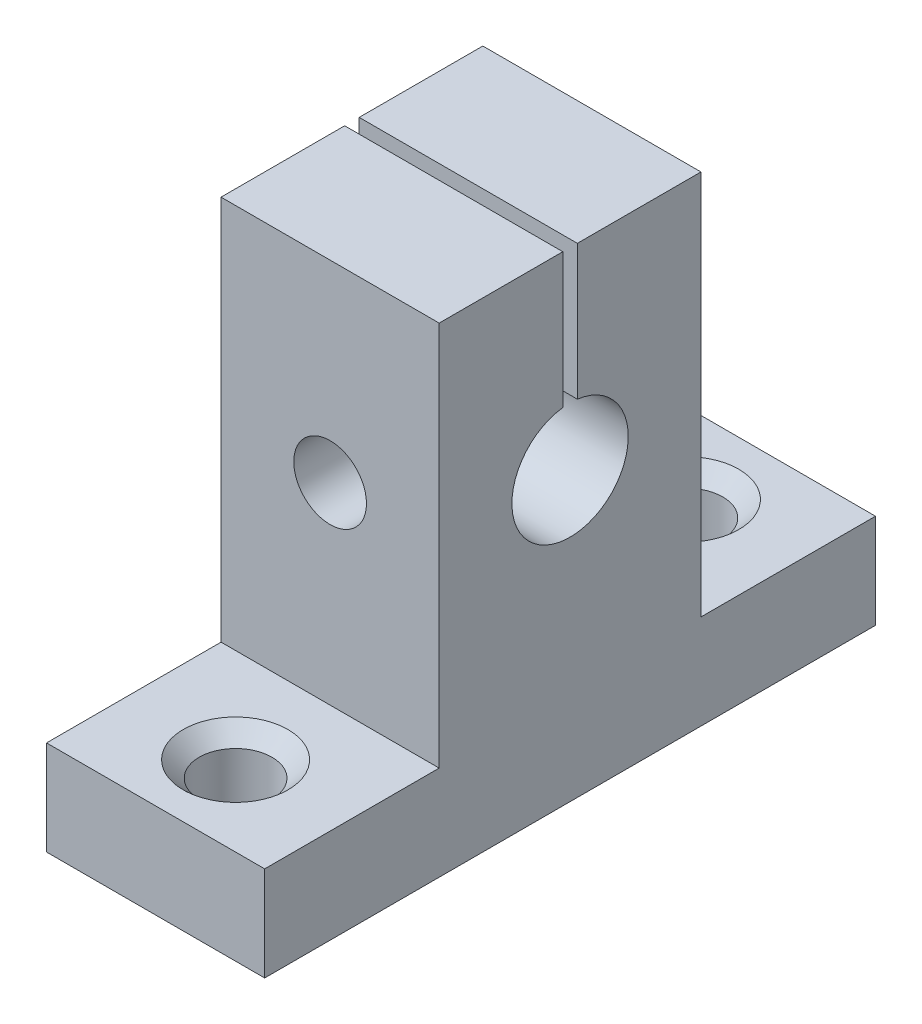
ISO-10303-21;
HEADER;
FILE_DESCRIPTION(('STEP AP214'),'2;1');
FILE_NAME('part.step','',(''),(''),'','','');
FILE_SCHEMA(('AUTOMOTIVE_DESIGN { 1 0 10303 214 1 1 1 1 }'));
ENDSEC;
DATA;
#1=APPLICATION_CONTEXT('core data for automotive mechanical design processes');
#2=APPLICATION_PROTOCOL_DEFINITION('international standard','automotive_design',2000,#1);
#3=PRODUCT_CONTEXT('',#1,'mechanical');
#4=PRODUCT('Part','Part','',(#3));
#5=PRODUCT_RELATED_PRODUCT_CATEGORY('part','',(#4));
#6=PRODUCT_DEFINITION_FORMATION('','',#4);
#7=PRODUCT_DEFINITION_CONTEXT('part definition',#1,'design');
#8=PRODUCT_DEFINITION('design','',#6,#7);
#9=PRODUCT_DEFINITION_SHAPE('','',#8);
#10=(LENGTH_UNIT() NAMED_UNIT(*) SI_UNIT(.MILLI.,.METRE.));
#11=(NAMED_UNIT(*) PLANE_ANGLE_UNIT() SI_UNIT($,.RADIAN.));
#12=(NAMED_UNIT(*) SI_UNIT($,.STERADIAN.) SOLID_ANGLE_UNIT());
#13=UNCERTAINTY_MEASURE_WITH_UNIT(LENGTH_MEASURE(1.E-05),#10,'distance_accuracy_value','');
#14=(GEOMETRIC_REPRESENTATION_CONTEXT(3) GLOBAL_UNCERTAINTY_ASSIGNED_CONTEXT((#13)) GLOBAL_UNIT_ASSIGNED_CONTEXT((#10,
#11,#12)) REPRESENTATION_CONTEXT('',''));
#15=CARTESIAN_POINT('',(0.,0.,0.));
#16=DIRECTION('',(0.,0.,1.));
#17=DIRECTION('',(1.,0.,0.));
#18=AXIS2_PLACEMENT_3D('',#15,#16,#17);
#19=CARTESIAN_POINT('',(15.,6.5,0.));
#20=DIRECTION('',(0.,0.,-1.));
#21=DIRECTION('',(0.,1.,0.));
#22=AXIS2_PLACEMENT_3D('',#19,#20,#21);
#23=PLANE('',#22);
#24=DIRECTION('',(0.,-1.,0.));
#25=VECTOR('',#24,1.);
#26=CARTESIAN_POINT('',(0.,6.5,0.));
#27=LINE('',#26,#25);
#28=CARTESIAN_POINT('',(0.,6.5,0.));
#29=VERTEX_POINT('',#28);
#30=CARTESIAN_POINT('',(0.,0.,0.));
#31=VERTEX_POINT('',#30);
#32=EDGE_CURVE('E163',#29,#31,#27,.T.);
#33=ORIENTED_EDGE('',*,*,#32,.T.);
#34=DIRECTION('',(-1.,0.,0.));
#35=VECTOR('',#34,1.);
#36=CARTESIAN_POINT('',(15.,0.,0.));
#37=LINE('',#36,#35);
#38=CARTESIAN_POINT('',(15.,0.,0.));
#39=VERTEX_POINT('',#38);
#40=EDGE_CURVE('E211',#39,#31,#37,.T.);
#41=ORIENTED_EDGE('',*,*,#40,.F.);
#42=DIRECTION('',(0.,-1.,0.));
#43=VECTOR('',#42,1.);
#44=CARTESIAN_POINT('',(15.,6.5,0.));
#45=LINE('',#44,#43);
#46=CARTESIAN_POINT('',(15.,6.5,0.));
#47=VERTEX_POINT('',#46);
#48=EDGE_CURVE('E186',#47,#39,#45,.T.);
#49=ORIENTED_EDGE('',*,*,#48,.F.);
#50=DIRECTION('',(-1.,0.,0.));
#51=VECTOR('',#50,1.);
#52=CARTESIAN_POINT('',(15.,6.5,0.));
#53=LINE('',#52,#51);
#54=EDGE_CURVE('E159',#47,#29,#53,.T.);
#55=ORIENTED_EDGE('',*,*,#54,.T.);
#56=EDGE_LOOP('',(#33,#41,#49,#55));
#57=FACE_BOUND('',#56,.T.);
#58=ADVANCED_FACE('F40',(#57),#23,.F.);
#59=CARTESIAN_POINT('',(15.,0.,0.));
#60=DIRECTION('',(0.,1.,0.));
#61=DIRECTION('',(0.,0.,1.));
#62=AXIS2_PLACEMENT_3D('',#59,#60,#61);
#63=PLANE('',#62);
#64=CARTESIAN_POINT('',(7.5,0.,-5.5));
#65=DIRECTION('',(0.,1.,0.));
#66=DIRECTION('',(0.,0.,1.));
#67=AXIS2_PLACEMENT_3D('',#64,#65,#66);
#68=CIRCLE('',#67,2.5);
#69=CARTESIAN_POINT('',(7.5,0.,-3.));
#70=VERTEX_POINT('',#69);
#71=EDGE_CURVE('E167',#70,#70,#68,.T.);
#72=ORIENTED_EDGE('',*,*,#71,.T.);
#73=EDGE_LOOP('',(#72));
#74=FACE_BOUND('',#73,.T.);
#75=CARTESIAN_POINT('',(7.5,0.,-36.5));
#76=DIRECTION('',(0.,1.,0.));
#77=DIRECTION('',(0.,0.,1.));
#78=AXIS2_PLACEMENT_3D('',#75,#76,#77);
#79=CIRCLE('',#78,2.5);
#80=CARTESIAN_POINT('',(7.5,0.,-34.));
#81=VERTEX_POINT('',#80);
#82=EDGE_CURVE('E312',#81,#81,#79,.T.);
#83=ORIENTED_EDGE('',*,*,#82,.T.);
#84=EDGE_LOOP('',(#83));
#85=FACE_BOUND('',#84,.T.);
#86=DIRECTION('',(0.,0.,-1.));
#87=VECTOR('',#86,1.);
#88=CARTESIAN_POINT('',(0.,0.,0.));
#89=LINE('',#88,#87);
#90=CARTESIAN_POINT('',(0.,0.,-42.));
#91=VERTEX_POINT('',#90);
#92=EDGE_CURVE('E166',#31,#91,#89,.T.);
#93=ORIENTED_EDGE('',*,*,#92,.T.);
#94=DIRECTION('',(-1.,0.,0.));
#95=VECTOR('',#94,1.);
#96=CARTESIAN_POINT('',(15.,0.,-42.));
#97=LINE('',#96,#95);
#98=CARTESIAN_POINT('',(15.,0.,-42.));
#99=VERTEX_POINT('',#98);
#100=EDGE_CURVE('E208',#99,#91,#97,.T.);
#101=ORIENTED_EDGE('',*,*,#100,.F.);
#102=DIRECTION('',(0.,0.,-1.));
#103=VECTOR('',#102,1.);
#104=CARTESIAN_POINT('',(15.,0.,0.));
#105=LINE('',#104,#103);
#106=EDGE_CURVE('E114',#39,#99,#105,.T.);
#107=ORIENTED_EDGE('',*,*,#106,.F.);
#108=ORIENTED_EDGE('',*,*,#40,.T.);
#109=EDGE_LOOP('',(#93,#101,#107,#108));
#110=FACE_BOUND('',#109,.T.);
#111=ADVANCED_FACE('F238',(#74,#85,#110),#63,.F.);
#112=CARTESIAN_POINT('',(15.,0.,-42.));
#113=DIRECTION('',(0.,0.,1.));
#114=DIRECTION('',(1.,0.,0.));
#115=AXIS2_PLACEMENT_3D('',#112,#113,#114);
#116=PLANE('',#115);
#117=DIRECTION('',(0.,1.,0.));
#118=VECTOR('',#117,1.);
#119=CARTESIAN_POINT('',(0.,0.,-42.));
#120=LINE('',#119,#118);
#121=CARTESIAN_POINT('',(0.,6.50000000000001,-42.));
#122=VERTEX_POINT('',#121);
#123=EDGE_CURVE('E169',#91,#122,#120,.T.);
#124=ORIENTED_EDGE('',*,*,#123,.T.);
#125=DIRECTION('',(-1.,0.,0.));
#126=VECTOR('',#125,1.);
#127=CARTESIAN_POINT('',(15.,6.50000000000001,-42.));
#128=LINE('',#127,#126);
#129=CARTESIAN_POINT('',(15.,6.50000000000001,-42.));
#130=VERTEX_POINT('',#129);
#131=EDGE_CURVE('E205',#130,#122,#128,.T.);
#132=ORIENTED_EDGE('',*,*,#131,.F.);
#133=DIRECTION('',(0.,1.,0.));
#134=VECTOR('',#133,1.);
#135=CARTESIAN_POINT('',(15.,0.,-42.));
#136=LINE('',#135,#134);
#137=EDGE_CURVE('E319',#99,#130,#136,.T.);
#138=ORIENTED_EDGE('',*,*,#137,.F.);
#139=ORIENTED_EDGE('',*,*,#100,.T.);
#140=EDGE_LOOP('',(#124,#132,#138,#139));
#141=FACE_BOUND('',#140,.T.);
#142=ADVANCED_FACE('F245',(#141),#116,.F.);
#143=CARTESIAN_POINT('',(15.,6.50000000000001,-42.));
#144=DIRECTION('',(0.,-1.,0.));
#145=DIRECTION('',(0.,0.,-1.));
#146=AXIS2_PLACEMENT_3D('',#143,#144,#145);
#147=PLANE('',#146);
#148=CARTESIAN_POINT('',(7.5,6.50000000000001,-36.5));
#149=DIRECTION('',(0.,-1.,0.));
#150=DIRECTION('',(0.,0.,-1.));
#151=AXIS2_PLACEMENT_3D('',#148,#149,#150);
#152=CIRCLE('',#151,3.6);
#153=CARTESIAN_POINT('',(7.5,6.50000000000001,-40.1));
#154=VERTEX_POINT('',#153);
#155=EDGE_CURVE('E11',#154,#154,#152,.T.);
#156=ORIENTED_EDGE('',*,*,#155,.T.);
#157=EDGE_LOOP('',(#156));
#158=FACE_BOUND('',#157,.T.);
#159=DIRECTION('',(0.,0.,1.));
#160=VECTOR('',#159,1.);
#161=CARTESIAN_POINT('',(0.,6.50000000000001,-42.));
#162=LINE('',#161,#160);
#163=CARTESIAN_POINT('',(0.,6.50000000000001,-30.));
#164=VERTEX_POINT('',#163);
#165=EDGE_CURVE('E171',#122,#164,#162,.T.);
#166=ORIENTED_EDGE('',*,*,#165,.T.);
#167=DIRECTION('',(-1.,0.,0.));
#168=VECTOR('',#167,1.);
#169=CARTESIAN_POINT('',(15.,6.50000000000001,-30.));
#170=LINE('',#169,#168);
#171=CARTESIAN_POINT('',(15.,6.50000000000001,-30.));
#172=VERTEX_POINT('',#171);
#173=EDGE_CURVE('E202',#172,#164,#170,.T.);
#174=ORIENTED_EDGE('',*,*,#173,.F.);
#175=DIRECTION('',(0.,0.,1.));
#176=VECTOR('',#175,1.);
#177=CARTESIAN_POINT('',(15.,6.50000000000001,-42.));
#178=LINE('',#177,#176);
#179=EDGE_CURVE('E321',#130,#172,#178,.T.);
#180=ORIENTED_EDGE('',*,*,#179,.F.);
#181=ORIENTED_EDGE('',*,*,#131,.T.);
#182=EDGE_LOOP('',(#166,#174,#180,#181));
#183=FACE_BOUND('',#182,.T.);
#184=ADVANCED_FACE('F255',(#158,#183),#147,.F.);
#185=CARTESIAN_POINT('',(15.,6.50000000000001,-30.));
#186=DIRECTION('',(0.,0.,1.));
#187=DIRECTION('',(1.,0.,0.));
#188=AXIS2_PLACEMENT_3D('',#185,#186,#187);
#189=PLANE('',#188);
#190=DIRECTION('',(0.,1.,0.));
#191=VECTOR('',#190,1.);
#192=CARTESIAN_POINT('',(0.,6.50000000000001,-30.));
#193=LINE('',#192,#191);
#194=CARTESIAN_POINT('',(0.,33.,-30.));
#195=VERTEX_POINT('',#194);
#196=EDGE_CURVE('E173',#164,#195,#193,.T.);
#197=ORIENTED_EDGE('',*,*,#196,.T.);
#198=DIRECTION('',(-1.,0.,0.));
#199=VECTOR('',#198,1.);
#200=CARTESIAN_POINT('',(15.,33.,-30.));
#201=LINE('',#200,#199);
#202=CARTESIAN_POINT('',(15.,33.,-30.));
#203=VERTEX_POINT('',#202);
#204=EDGE_CURVE('E199',#203,#195,#201,.T.);
#205=ORIENTED_EDGE('',*,*,#204,.F.);
#206=DIRECTION('',(0.,1.,0.));
#207=VECTOR('',#206,1.);
#208=CARTESIAN_POINT('',(15.,6.50000000000001,-30.));
#209=LINE('',#208,#207);
#210=EDGE_CURVE('E323',#172,#203,#209,.T.);
#211=ORIENTED_EDGE('',*,*,#210,.F.);
#212=ORIENTED_EDGE('',*,*,#173,.T.);
#213=EDGE_LOOP('',(#197,#205,#211,#212));
#214=FACE_BOUND('',#213,.T.);
#215=ADVANCED_FACE('F259',(#214),#189,.F.);
#216=CARTESIAN_POINT('',(15.,33.,-30.));
#217=DIRECTION('',(0.,-1.,0.));
#218=DIRECTION('',(0.,0.,-1.));
#219=AXIS2_PLACEMENT_3D('',#216,#217,#218);
#220=PLANE('',#219);
#221=DIRECTION('',(0.,0.,1.));
#222=VECTOR('',#221,1.);
#223=CARTESIAN_POINT('',(0.,33.,-30.));
#224=LINE('',#223,#222);
#225=CARTESIAN_POINT('',(0.,33.,-21.5));
#226=VERTEX_POINT('',#225);
#227=EDGE_CURVE('E175',#195,#226,#224,.T.);
#228=ORIENTED_EDGE('',*,*,#227,.T.);
#229=DIRECTION('',(-1.,0.,0.));
#230=VECTOR('',#229,1.);
#231=CARTESIAN_POINT('',(15.,33.,-21.5));
#232=LINE('',#231,#230);
#233=CARTESIAN_POINT('',(15.,33.,-21.5));
#234=VERTEX_POINT('',#233);
#235=EDGE_CURVE('E196',#234,#226,#232,.T.);
#236=ORIENTED_EDGE('',*,*,#235,.F.);
#237=DIRECTION('',(0.,0.,1.));
#238=VECTOR('',#237,1.);
#239=CARTESIAN_POINT('',(15.,33.,-30.));
#240=LINE('',#239,#238);
#241=EDGE_CURVE('E325',#203,#234,#240,.T.);
#242=ORIENTED_EDGE('',*,*,#241,.F.);
#243=ORIENTED_EDGE('',*,*,#204,.T.);
#244=EDGE_LOOP('',(#228,#236,#242,#243));
#245=FACE_BOUND('',#244,.T.);
#246=ADVANCED_FACE('F263',(#245),#220,.F.);
#247=CARTESIAN_POINT('',(15.,33.,-21.5));
#248=DIRECTION('',(0.,0.,-1.));
#249=DIRECTION('',(0.,1.,0.));
#250=AXIS2_PLACEMENT_3D('',#247,#248,#249);
#251=PLANE('',#250);
#252=DIRECTION('',(0.,-1.,0.));
#253=VECTOR('',#252,1.);
#254=CARTESIAN_POINT('',(0.,33.,-21.5));
#255=LINE('',#254,#253);
#256=CARTESIAN_POINT('',(0.,23.7186269665969,-21.5));
#257=VERTEX_POINT('',#256);
#258=EDGE_CURVE('E177',#226,#257,#255,.T.);
#259=ORIENTED_EDGE('',*,*,#258,.T.);
#260=DIRECTION('',(-1.,0.,0.));
#261=VECTOR('',#260,1.);
#262=CARTESIAN_POINT('',(15.,23.7186269665969,-21.5));
#263=LINE('',#262,#261);
#264=CARTESIAN_POINT('',(15.,23.7186269665969,-21.5));
#265=VERTEX_POINT('',#264);
#266=EDGE_CURVE('E193',#265,#257,#263,.T.);
#267=ORIENTED_EDGE('',*,*,#266,.F.);
#268=DIRECTION('',(0.,-1.,0.));
#269=VECTOR('',#268,1.);
#270=CARTESIAN_POINT('',(15.,33.,-21.5));
#271=LINE('',#270,#269);
#272=EDGE_CURVE('E327',#234,#265,#271,.T.);
#273=ORIENTED_EDGE('',*,*,#272,.F.);
#274=ORIENTED_EDGE('',*,*,#235,.T.);
#275=EDGE_LOOP('',(#259,#267,#273,#274));
#276=FACE_BOUND('',#275,.T.);
#277=ADVANCED_FACE('F267',(#276),#251,.F.);
#278=CARTESIAN_POINT('',(15.,19.75,-21.));
#279=DIRECTION('',(-1.,0.,0.));
#280=DIRECTION('',(0.,0.,1.));
#281=AXIS2_PLACEMENT_3D('',#278,#279,#280);
#282=CYLINDRICAL_SURFACE('',#281,3.99999999999999);
#283=CARTESIAN_POINT('',(10.,19.75,-17.));
#284=CARTESIAN_POINT('',(9.99998952385639,19.6229825234401,-17.0000095866643));
#285=CARTESIAN_POINT('',(9.99025350009832,19.4958080482083,-17.0061139340601));
#286=CARTESIAN_POINT('',(9.95182887031573,19.2453625433787,-17.0299562444741));
#287=CARTESIAN_POINT('',(9.92310413973879,19.122099424174,-17.0477163812686));
#288=CARTESIAN_POINT('',(9.84837714671246,18.8835891317308,-17.0930830470644));
#289=CARTESIAN_POINT('',(9.80246039021243,18.7683055792906,-17.1206408130912));
#290=CARTESIAN_POINT('',(9.69522833250852,18.5474791956501,-17.1833080016172));
#291=CARTESIAN_POINT('',(9.63391473744687,18.441935286959,-17.2184165873391));
#292=CARTESIAN_POINT('',(9.4922268434089,18.2340516356292,-17.2965969505453));
#293=CARTESIAN_POINT('',(9.41072139729824,18.1326408838321,-17.3400807578211));
#294=CARTESIAN_POINT('',(9.23356165374148,17.9440272443272,-17.4293729994108));
#295=CARTESIAN_POINT('',(9.13788834426107,17.856843784056,-17.4751845021704));
#296=CARTESIAN_POINT('',(8.91993221070879,17.6871425369748,-17.5713916276437));
#297=CARTESIAN_POINT('',(8.79580042656905,17.6068558798168,-17.6215677803385));
#298=CARTESIAN_POINT('',(8.53287036932165,17.4685206792,-17.713396037219));
#299=CARTESIAN_POINT('',(8.39409737483202,17.4104345821256,-17.7550624799954));
#300=CARTESIAN_POINT('',(8.14237895245428,17.3313319881942,-17.8138084875119));
#301=CARTESIAN_POINT('',(8.03206636308168,17.3046089520532,-17.8344618802911));
#302=CARTESIAN_POINT('',(7.80738814861931,17.2663631288086,-17.8643728533914));
#303=CARTESIAN_POINT('',(7.69302848282679,17.2548188751436,-17.8736465262154));
#304=CARTESIAN_POINT('',(7.46317396712363,17.247621633095,-17.879402284655));
#305=CARTESIAN_POINT('',(7.34767692942204,17.2520103179912,-17.8758508257204));
#306=CARTESIAN_POINT('',(7.11937979127336,17.2764736665217,-17.8564519511659));
#307=CARTESIAN_POINT('',(7.00658192715007,17.2965609025485,-17.8405946803451));
#308=CARTESIAN_POINT('',(6.78912310325641,17.3506379053574,-17.7993485417785));
#309=CARTESIAN_POINT('',(6.68433512028263,17.384299564774,-17.7741857134643));
#310=CARTESIAN_POINT('',(6.48167760352679,17.4641963041049,-17.7170886555658));
#311=CARTESIAN_POINT('',(6.38381053215654,17.5104358310596,-17.6851520319148));
#312=CARTESIAN_POINT('',(6.17833359248984,17.6241016959274,-17.6109037490434));
#313=CARTESIAN_POINT('',(6.07231894814762,17.6938722634225,-17.5677684479145));
#314=CARTESIAN_POINT('',(5.8723388730236,17.8482388804136,-17.4798854844529));
#315=CARTESIAN_POINT('',(5.77838599995486,17.9328501674866,-17.4351362028598));
#316=CARTESIAN_POINT('',(5.58939899041739,18.1309526712227,-17.340403325394));
#317=CARTESIAN_POINT('',(5.4967440572784,18.2469055257998,-17.2907742855627));
#318=CARTESIAN_POINT('',(5.33228820636899,18.4957355553149,-17.1994339815933));
#319=CARTESIAN_POINT('',(5.26047909219051,18.6286060487299,-17.1577196077133));
#320=CARTESIAN_POINT('',(5.17265404336502,18.8342242484326,-17.105640241301));
#321=CARTESIAN_POINT('',(5.1471657135696,18.9018064168126,-17.0903312561473));
#322=CARTESIAN_POINT('',(5.10199234952136,19.0395079505216,-17.0629816012456));
#323=CARTESIAN_POINT('',(5.08230396342918,19.1096258240321,-17.0509390441197));
#324=CARTESIAN_POINT('',(5.04906583835761,19.2517609804615,-17.0305030047215));
#325=CARTESIAN_POINT('',(5.035510596474,19.3237764990847,-17.0221062515612));
#326=CARTESIAN_POINT('',(5.01475370668643,19.4690343264393,-17.0092123350867));
#327=CARTESIAN_POINT('',(5.00755097345269,19.5422764234293,-17.0047145056415));
#328=CARTESIAN_POINT('',(4.99689069535646,19.7408808231032,-16.9980622652583));
#329=CARTESIAN_POINT('',(4.99959963687648,19.8667820167057,-16.999761877634));
#330=CARTESIAN_POINT('',(5.02375966446545,20.1159677660117,-17.0148168659169));
#331=CARTESIAN_POINT('',(5.04520947392473,20.23925249936,-17.028171447899));
#332=CARTESIAN_POINT('',(5.10447858798278,20.4750361940026,-17.0645202444463));
#333=CARTESIAN_POINT('',(5.14162472076979,20.5877684210629,-17.0871169362887));
#334=CARTESIAN_POINT('',(5.23059237131243,20.8052781612533,-17.1400859710213));
#335=CARTESIAN_POINT('',(5.28241634650143,20.910054338616,-17.1704596158836));
#336=CARTESIAN_POINT('',(5.40503053750783,21.1201676196919,-17.2401998597934));
#337=CARTESIAN_POINT('',(5.47720717227503,21.2244938029691,-17.2801647324463));
#338=CARTESIAN_POINT('',(5.63558769646929,21.4202854133007,-17.3638605711427));
#339=CARTESIAN_POINT('',(5.72180716888569,21.5117363403803,-17.4075956952687));
#340=CARTESIAN_POINT('',(5.92027008984566,21.6929483527625,-17.5018826151327));
#341=CARTESIAN_POINT('',(6.03447441549753,21.7805370273364,-17.5525023342081));
#342=CARTESIAN_POINT('',(6.27775156698258,21.9356070491644,-17.6486647425311));
#343=CARTESIAN_POINT('',(6.40681401289132,22.0031023169377,-17.6942109329163));
#344=CARTESIAN_POINT('',(6.64938429659957,22.1036954382102,-17.7653293942116));
#345=CARTESIAN_POINT('',(6.76048150138871,22.1410379172069,-17.793087276362));
#346=CARTESIAN_POINT('',(6.98878629161345,22.2000021642075,-17.8378993864875));
#347=CARTESIAN_POINT('',(7.10598401968943,22.2216484980525,-17.8549703347018));
#348=CARTESIAN_POINT('',(7.3441805529704,22.2480276746923,-17.875873500674));
#349=CARTESIAN_POINT('',(7.46519716787993,22.2526637458647,-17.8796299680684));
#350=CARTESIAN_POINT('',(7.70626192382951,22.2443955677353,-17.8730187362428));
#351=CARTESIAN_POINT('',(7.82630972961935,22.2314854882146,-17.8626463422952));
#352=CARTESIAN_POINT('',(8.0520595794361,22.190765470861,-17.8308922299001));
#353=CARTESIAN_POINT('',(8.15813856450237,22.1642384719172,-17.8104638581093));
#354=CARTESIAN_POINT('',(8.36427015751825,22.0983523874343,-17.7616493721478));
#355=CARTESIAN_POINT('',(8.46432023181727,22.0589879509078,-17.7332599402869));
#356=CARTESIAN_POINT('',(8.67119332433813,21.9620541580396,-17.6667220238215));
#357=CARTESIAN_POINT('',(8.77689994626374,21.9026742798167,-17.6277557147592));
#358=CARTESIAN_POINT('',(8.97787738570925,21.7699989488921,-17.5466455467601));
#359=CARTESIAN_POINT('',(9.07313966737408,21.6966922459469,-17.50449913561));
#360=CARTESIAN_POINT('',(9.27002558379842,21.5213466968594,-17.4119632457315));
#361=CARTESIAN_POINT('',(9.36916976153928,21.4164928448989,-17.3615951173972));
#362=CARTESIAN_POINT('',(9.54900159612505,21.1896193799085,-17.2660194616177));
#363=CARTESIAN_POINT('',(9.62967782367751,21.0675892119665,-17.2208151385274));
#364=CARTESIAN_POINT('',(9.73456343855875,20.8734635794255,-17.1604078527159));
#365=CARTESIAN_POINT('',(9.76687480004698,20.806796011581,-17.1414816584294));
#366=CARTESIAN_POINT('',(9.82567225182379,20.6701995843741,-17.1066483460212));
#367=CARTESIAN_POINT('',(9.85216170113509,20.600272633932,-17.0907394877408));
#368=CARTESIAN_POINT('',(9.89885714446216,20.4578736884378,-17.0624662582448));
#369=CARTESIAN_POINT('',(9.91908005724566,20.3854091445723,-17.0500923503482));
#370=CARTESIAN_POINT('',(9.95297545558237,20.2384569895571,-17.0292432254194));
#371=CARTESIAN_POINT('',(9.96665277243948,20.1639709135455,-17.0207651330708));
#372=CARTESIAN_POINT('',(9.98459041022673,20.0328526050941,-17.0096172870823));
#373=CARTESIAN_POINT('',(9.99036153025218,19.9765015159149,-17.0060184048241));
#374=CARTESIAN_POINT('',(9.99806878362715,19.8634440745191,-17.0012075462707));
#375=CARTESIAN_POINT('',(10.0000046796104,19.8067377005313,-16.999995717713));
#376=CARTESIAN_POINT('',(10.,19.75,-17.));
#377=B_SPLINE_CURVE_WITH_KNOTS('',3,(#283,#284,#285,#286,#287,#288,#289,#290,#291,#292,#293,
#294,#295,#296,#297,#298,#299,#300,#301,#302,#303,#304,#305,#306,#307,#308,#309,#310,#311,#312,
#313,#314,#315,#316,#317,#318,#319,#320,#321,#322,#323,#324,#325,#326,#327,#328,#329,#330,#331,
#332,#333,#334,#335,#336,#337,#338,#339,#340,#341,#342,#343,#344,#345,#346,#347,#348,#349,#350,
#351,#352,#353,#354,#355,#356,#357,#358,#359,#360,#361,#362,#363,#364,#365,#366,#367,#368,#369,
#370,#371,#372,#373,#374,#375,#376),.UNSPECIFIED.,.T.,.F.,(4,2,2,2,2,2,2,2,2,2,2,2,2,2,2,2,2,2,
2,2,2,2,2,2,2,2,2,2,2,2,2,2,2,2,2,2,2,2,2,2,2,2,2,2,2,2,4),(0.,0.380824602868265,
0.762375788256924,1.14205397519028,1.5216901080776,1.93164374107244,2.34215256651403,
2.80825951705947,3.27357449214021,3.61824017759434,3.96241789414782,4.30749646997556,
4.65285169010166,4.99031678920873,5.32790135816066,5.72854900708719,6.12961045150363,
6.59684361399044,7.06389281455722,7.28510978359955,7.50619865744382,7.72708876613707,
7.94794112831293,8.32363778110177,8.69930884379593,9.06028425977629,9.42132014771965,
9.81879878896137,10.216721545704,10.6724083464246,11.1277787130885,11.4876929754247,
11.8470427174174,12.2084336629143,12.5699447204276,12.9023575499051,13.2349091154192,
13.6156046298899,13.9966089922257,14.4531049498525,14.9098826607203,15.138984863948,
15.3679545348469,15.5963005225022,15.8244777070605,15.994578512822,16.1646898459841),.UNSPECIFIED.);
#378=CARTESIAN_POINT('',(10.,19.75,-17.));
#379=VERTEX_POINT('',#378);
#380=EDGE_CURVE('E303',#379,#379,#377,.T.);
#381=ORIENTED_EDGE('',*,*,#380,.F.);
#382=EDGE_LOOP('',(#381));
#383=FACE_BOUND('',#382,.T.);
#384=CARTESIAN_POINT('',(0.,19.75,-21.));
#385=DIRECTION('',(-1.,0.,0.));
#386=DIRECTION('',(0.,0.,-1.));
#387=AXIS2_PLACEMENT_3D('',#384,#385,#386);
#388=CIRCLE('',#387,3.99999999999999);
#389=CARTESIAN_POINT('',(0.,23.7186269665969,-20.5));
#390=VERTEX_POINT('',#389);
#391=EDGE_CURVE('E179',#257,#390,#388,.T.);
#392=ORIENTED_EDGE('',*,*,#391,.T.);
#393=DIRECTION('',(-1.,0.,0.));
#394=VECTOR('',#393,1.);
#395=CARTESIAN_POINT('',(15.,23.7186269665969,-20.5));
#396=LINE('',#395,#394);
#397=CARTESIAN_POINT('',(15.,23.7186269665969,-20.5));
#398=VERTEX_POINT('',#397);
#399=EDGE_CURVE('E190',#398,#390,#396,.T.);
#400=ORIENTED_EDGE('',*,*,#399,.F.);
#401=CARTESIAN_POINT('',(15.,19.75,-21.));
#402=DIRECTION('',(-1.,0.,0.));
#403=DIRECTION('',(0.,0.,-1.));
#404=AXIS2_PLACEMENT_3D('',#401,#402,#403);
#405=CIRCLE('',#404,3.99999999999999);
#406=EDGE_CURVE('E329',#265,#398,#405,.T.);
#407=ORIENTED_EDGE('',*,*,#406,.F.);
#408=ORIENTED_EDGE('',*,*,#266,.T.);
#409=EDGE_LOOP('',(#392,#400,#407,#408));
#410=FACE_BOUND('',#409,.T.);
#411=ADVANCED_FACE('F271',(#383,#410),#282,.F.);
#412=CARTESIAN_POINT('',(15.,33.,-20.5));
#413=DIRECTION('',(0.,0.,1.));
#414=DIRECTION('',(0.,-1.,0.));
#415=AXIS2_PLACEMENT_3D('',#412,#413,#414);
#416=PLANE('',#415);
#417=DIRECTION('',(0.,1.,0.));
#418=VECTOR('',#417,1.);
#419=CARTESIAN_POINT('',(0.,33.,-20.5));
#420=LINE('',#419,#418);
#421=CARTESIAN_POINT('',(0.,33.,-20.5));
#422=VERTEX_POINT('',#421);
#423=EDGE_CURVE('E181',#390,#422,#420,.T.);
#424=ORIENTED_EDGE('',*,*,#423,.T.);
#425=DIRECTION('',(-1.,0.,0.));
#426=VECTOR('',#425,1.);
#427=CARTESIAN_POINT('',(15.,33.,-20.5));
#428=LINE('',#427,#426);
#429=CARTESIAN_POINT('',(15.,33.,-20.5));
#430=VERTEX_POINT('',#429);
#431=EDGE_CURVE('E154',#430,#422,#428,.T.);
#432=ORIENTED_EDGE('',*,*,#431,.F.);
#433=DIRECTION('',(0.,1.,0.));
#434=VECTOR('',#433,1.);
#435=CARTESIAN_POINT('',(15.,33.,-20.5));
#436=LINE('',#435,#434);
#437=EDGE_CURVE('E145',#398,#430,#436,.T.);
#438=ORIENTED_EDGE('',*,*,#437,.F.);
#439=ORIENTED_EDGE('',*,*,#399,.T.);
#440=EDGE_LOOP('',(#424,#432,#438,#439));
#441=FACE_BOUND('',#440,.T.);
#442=ADVANCED_FACE('F274',(#441),#416,.F.);
#443=CARTESIAN_POINT('',(15.,33.,-20.5));
#444=DIRECTION('',(0.,-1.,0.));
#445=DIRECTION('',(0.,0.,-1.));
#446=AXIS2_PLACEMENT_3D('',#443,#444,#445);
#447=PLANE('',#446);
#448=DIRECTION('',(0.,0.,1.));
#449=VECTOR('',#448,1.);
#450=CARTESIAN_POINT('',(0.,33.,-20.5));
#451=LINE('',#450,#449);
#452=CARTESIAN_POINT('',(0.,33.,-12.));
#453=VERTEX_POINT('',#452);
#454=EDGE_CURVE('E153',#422,#453,#451,.T.);
#455=ORIENTED_EDGE('',*,*,#454,.T.);
#456=DIRECTION('',(-1.,0.,0.));
#457=VECTOR('',#456,1.);
#458=CARTESIAN_POINT('',(15.,33.,-12.));
#459=LINE('',#458,#457);
#460=CARTESIAN_POINT('',(15.,33.,-12.));
#461=VERTEX_POINT('',#460);
#462=EDGE_CURVE('E150',#461,#453,#459,.T.);
#463=ORIENTED_EDGE('',*,*,#462,.F.);
#464=DIRECTION('',(0.,0.,1.));
#465=VECTOR('',#464,1.);
#466=CARTESIAN_POINT('',(15.,33.,-20.5));
#467=LINE('',#466,#465);
#468=EDGE_CURVE('E139',#430,#461,#467,.T.);
#469=ORIENTED_EDGE('',*,*,#468,.F.);
#470=ORIENTED_EDGE('',*,*,#431,.T.);
#471=EDGE_LOOP('',(#455,#463,#469,#470));
#472=FACE_BOUND('',#471,.T.);
#473=ADVANCED_FACE('F151',(#472),#447,.F.);
#474=CARTESIAN_POINT('',(15.,33.,-12.));
#475=DIRECTION('',(0.,0.,-1.));
#476=DIRECTION('',(0.,1.,0.));
#477=AXIS2_PLACEMENT_3D('',#474,#475,#476);
#478=PLANE('',#477);
#479=CARTESIAN_POINT('',(7.5,19.75,-12.));
#480=DIRECTION('',(0.,0.,1.));
#481=DIRECTION('',(1.,0.,0.));
#482=AXIS2_PLACEMENT_3D('',#479,#480,#481);
#483=CIRCLE('',#482,2.5);
#484=CARTESIAN_POINT('',(10.,19.75,-12.));
#485=VERTEX_POINT('',#484);
#486=EDGE_CURVE('E309',#485,#485,#483,.T.);
#487=ORIENTED_EDGE('',*,*,#486,.F.);
#488=EDGE_LOOP('',(#487));
#489=FACE_BOUND('',#488,.T.);
#490=DIRECTION('',(0.,-1.,0.));
#491=VECTOR('',#490,1.);
#492=CARTESIAN_POINT('',(0.,33.,-12.));
#493=LINE('',#492,#491);
#494=CARTESIAN_POINT('',(0.,6.5,-12.));
#495=VERTEX_POINT('',#494);
#496=EDGE_CURVE('E99',#453,#495,#493,.T.);
#497=ORIENTED_EDGE('',*,*,#496,.T.);
#498=DIRECTION('',(-1.,0.,0.));
#499=VECTOR('',#498,1.);
#500=CARTESIAN_POINT('',(15.,6.5,-12.));
#501=LINE('',#500,#499);
#502=CARTESIAN_POINT('',(15.,6.5,-12.));
#503=VERTEX_POINT('',#502);
#504=EDGE_CURVE('E155',#503,#495,#501,.T.);
#505=ORIENTED_EDGE('',*,*,#504,.F.);
#506=DIRECTION('',(0.,-1.,0.));
#507=VECTOR('',#506,1.);
#508=CARTESIAN_POINT('',(15.,33.,-12.));
#509=LINE('',#508,#507);
#510=EDGE_CURVE('E143',#461,#503,#509,.T.);
#511=ORIENTED_EDGE('',*,*,#510,.F.);
#512=ORIENTED_EDGE('',*,*,#462,.T.);
#513=EDGE_LOOP('',(#497,#505,#511,#512));
#514=FACE_BOUND('',#513,.T.);
#515=ADVANCED_FACE('F157',(#489,#514),#478,.F.);
#516=CARTESIAN_POINT('',(15.,6.5,-12.));
#517=DIRECTION('',(0.,-1.,0.));
#518=DIRECTION('',(0.,0.,-1.));
#519=AXIS2_PLACEMENT_3D('',#516,#517,#518);
#520=PLANE('',#519);
#521=CARTESIAN_POINT('',(7.5,6.5,-5.5));
#522=DIRECTION('',(0.,-1.,0.));
#523=DIRECTION('',(0.,0.,-1.));
#524=AXIS2_PLACEMENT_3D('',#521,#522,#523);
#525=CIRCLE('',#524,3.59999999999998);
#526=CARTESIAN_POINT('',(7.5,6.5,-9.09999999999998));
#527=VERTEX_POINT('',#526);
#528=EDGE_CURVE('E216',#527,#527,#525,.T.);
#529=ORIENTED_EDGE('',*,*,#528,.T.);
#530=EDGE_LOOP('',(#529));
#531=FACE_BOUND('',#530,.T.);
#532=DIRECTION('',(0.,0.,1.));
#533=VECTOR('',#532,1.);
#534=CARTESIAN_POINT('',(0.,6.5,-12.));
#535=LINE('',#534,#533);
#536=EDGE_CURVE('E105',#495,#29,#535,.T.);
#537=ORIENTED_EDGE('',*,*,#536,.T.);
#538=ORIENTED_EDGE('',*,*,#54,.F.);
#539=DIRECTION('',(0.,0.,1.));
#540=VECTOR('',#539,1.);
#541=CARTESIAN_POINT('',(15.,6.5,-12.));
#542=LINE('',#541,#540);
#543=EDGE_CURVE('E58',#503,#47,#542,.T.);
#544=ORIENTED_EDGE('',*,*,#543,.F.);
#545=ORIENTED_EDGE('',*,*,#504,.T.);
#546=EDGE_LOOP('',(#537,#538,#544,#545));
#547=FACE_BOUND('',#546,.T.);
#548=ADVANCED_FACE('F283',(#531,#547),#520,.F.);
#549=CARTESIAN_POINT('',(15.,19.75,-21.));
#550=DIRECTION('',(1.,0.,0.));
#551=DIRECTION('',(0.,0.,-1.));
#552=AXIS2_PLACEMENT_3D('',#549,#550,#551);
#553=PLANE('',#552);
#554=ORIENTED_EDGE('',*,*,#48,.T.);
#555=ORIENTED_EDGE('',*,*,#106,.T.);
#556=ORIENTED_EDGE('',*,*,#137,.T.);
#557=ORIENTED_EDGE('',*,*,#179,.T.);
#558=ORIENTED_EDGE('',*,*,#210,.T.);
#559=ORIENTED_EDGE('',*,*,#241,.T.);
#560=ORIENTED_EDGE('',*,*,#272,.T.);
#561=ORIENTED_EDGE('',*,*,#406,.T.);
#562=ORIENTED_EDGE('',*,*,#437,.T.);
#563=ORIENTED_EDGE('',*,*,#468,.T.);
#564=ORIENTED_EDGE('',*,*,#510,.T.);
#565=ORIENTED_EDGE('',*,*,#543,.T.);
#566=EDGE_LOOP('',(#554,#555,#556,#557,#558,#559,#560,#561,#562,#563,#564,#565));
#567=FACE_BOUND('',#566,.T.);
#568=ADVANCED_FACE('F141',(#567),#553,.T.);
#569=CARTESIAN_POINT('',(0.,19.75,-21.));
#570=DIRECTION('',(1.,0.,0.));
#571=DIRECTION('',(0.,0.,-1.));
#572=AXIS2_PLACEMENT_3D('',#569,#570,#571);
#573=PLANE('',#572);
#574=ORIENTED_EDGE('',*,*,#32,.F.);
#575=ORIENTED_EDGE('',*,*,#536,.F.);
#576=ORIENTED_EDGE('',*,*,#496,.F.);
#577=ORIENTED_EDGE('',*,*,#454,.F.);
#578=ORIENTED_EDGE('',*,*,#423,.F.);
#579=ORIENTED_EDGE('',*,*,#391,.F.);
#580=ORIENTED_EDGE('',*,*,#258,.F.);
#581=ORIENTED_EDGE('',*,*,#227,.F.);
#582=ORIENTED_EDGE('',*,*,#196,.F.);
#583=ORIENTED_EDGE('',*,*,#165,.F.);
#584=ORIENTED_EDGE('',*,*,#123,.F.);
#585=ORIENTED_EDGE('',*,*,#92,.F.);
#586=EDGE_LOOP('',(#574,#575,#576,#577,#578,#579,#580,#581,#582,#583,#584,#585));
#587=FACE_BOUND('',#586,.T.);
#588=ADVANCED_FACE('F288',(#587),#573,.F.);
#589=CARTESIAN_POINT('',(7.5,0.,-5.5));
#590=DIRECTION('',(0.,1.,0.));
#591=DIRECTION('',(0.,0.,1.));
#592=AXIS2_PLACEMENT_3D('',#589,#590,#591);
#593=CYLINDRICAL_SURFACE('',#592,2.5);
#594=CARTESIAN_POINT('',(7.5,5.40000000000003,-5.5));
#595=DIRECTION('',(0.,-1.,0.));
#596=DIRECTION('',(0.,0.,-1.));
#597=AXIS2_PLACEMENT_3D('',#594,#595,#596);
#598=CIRCLE('',#597,2.5);
#599=CARTESIAN_POINT('',(7.5,5.40000000000003,-8.));
#600=VERTEX_POINT('',#599);
#601=EDGE_CURVE('E213',#600,#600,#598,.F.);
#602=ORIENTED_EDGE('',*,*,#601,.T.);
#603=EDGE_LOOP('',(#602));
#604=FACE_BOUND('',#603,.T.);
#605=ORIENTED_EDGE('',*,*,#71,.F.);
#606=EDGE_LOOP('',(#605));
#607=FACE_BOUND('',#606,.T.);
#608=ADVANCED_FACE('F291',(#604,#607),#593,.F.);
#609=CARTESIAN_POINT('',(7.5,0.,-36.5));
#610=DIRECTION('',(0.,1.,0.));
#611=DIRECTION('',(0.,0.,1.));
#612=AXIS2_PLACEMENT_3D('',#609,#610,#611);
#613=CYLINDRICAL_SURFACE('',#612,2.5);
#614=CARTESIAN_POINT('',(7.5,5.40000000000002,-36.5));
#615=DIRECTION('',(0.,-1.,0.));
#616=DIRECTION('',(0.,0.,-1.));
#617=AXIS2_PLACEMENT_3D('',#614,#615,#616);
#618=CIRCLE('',#617,2.5);
#619=CARTESIAN_POINT('',(7.5,5.40000000000002,-39.));
#620=VERTEX_POINT('',#619);
#621=EDGE_CURVE('E50',#620,#620,#618,.F.);
#622=ORIENTED_EDGE('',*,*,#621,.T.);
#623=EDGE_LOOP('',(#622));
#624=FACE_BOUND('',#623,.T.);
#625=ORIENTED_EDGE('',*,*,#82,.F.);
#626=EDGE_LOOP('',(#625));
#627=FACE_BOUND('',#626,.T.);
#628=ADVANCED_FACE('F221',(#624,#627),#613,.F.);
#629=CARTESIAN_POINT('',(7.5,5.40000000000003,-5.5));
#630=DIRECTION('',(0.,1.,0.));
#631=DIRECTION('',(0.,0.,1.));
#632=AXIS2_PLACEMENT_3D('',#629,#630,#631);
#633=CONICAL_SURFACE('',#632,2.5,0.785398163397451);
#634=ORIENTED_EDGE('',*,*,#528,.F.);
#635=EDGE_LOOP('',(#634));
#636=FACE_BOUND('',#635,.T.);
#637=ORIENTED_EDGE('',*,*,#601,.F.);
#638=EDGE_LOOP('',(#637));
#639=FACE_BOUND('',#638,.T.);
#640=ADVANCED_FACE('F226',(#636,#639),#633,.F.);
#641=CARTESIAN_POINT('',(7.5,5.40000000000002,-36.5));
#642=DIRECTION('',(0.,1.,0.));
#643=DIRECTION('',(0.,0.,1.));
#644=AXIS2_PLACEMENT_3D('',#641,#642,#643);
#645=CONICAL_SURFACE('',#644,2.5,0.785398163397452);
#646=ORIENTED_EDGE('',*,*,#155,.F.);
#647=EDGE_LOOP('',(#646));
#648=FACE_BOUND('',#647,.T.);
#649=ORIENTED_EDGE('',*,*,#621,.F.);
#650=EDGE_LOOP('',(#649));
#651=FACE_BOUND('',#650,.T.);
#652=ADVANCED_FACE('F43',(#648,#651),#645,.F.);
#653=CARTESIAN_POINT('',(7.5,19.75,-42.001));
#654=DIRECTION('',(0.,0.,1.));
#655=DIRECTION('',(1.,0.,0.));
#656=AXIS2_PLACEMENT_3D('',#653,#654,#655);
#657=CYLINDRICAL_SURFACE('',#656,2.5);
#658=ORIENTED_EDGE('',*,*,#486,.T.);
#659=EDGE_LOOP('',(#658));
#660=FACE_BOUND('',#659,.T.);
#661=ORIENTED_EDGE('',*,*,#380,.T.);
#662=EDGE_LOOP('',(#661));
#663=FACE_BOUND('',#662,.T.);
#664=ADVANCED_FACE('F225',(#660,#663),#657,.F.);
#665=CLOSED_SHELL('',(#58,#111,#142,#184,#215,#246,#277,#411,#442,#473,#515,#548,#568,#588,#608,
#628,#640,#652,#664));
#666=MANIFOLD_SOLID_BREP('B2',#665);
#667=ADVANCED_BREP_SHAPE_REPRESENTATION('',(#18,#666),#14);
#668=SHAPE_DEFINITION_REPRESENTATION(#9,#667);
ENDSEC;
END-ISO-10303-21;
